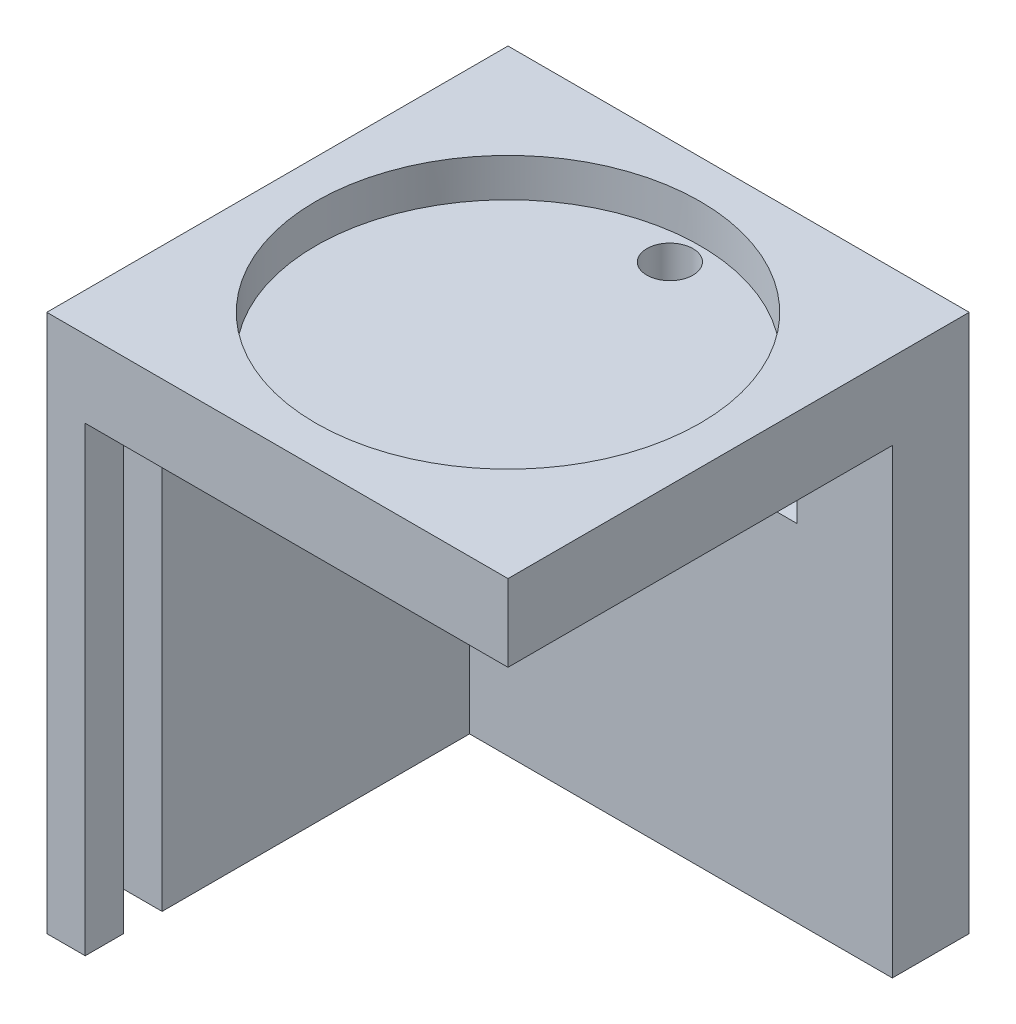
ISO-10303-21;
HEADER;
FILE_DESCRIPTION(('STEP AP214'),'2;1');
FILE_NAME('part.step','',(''),(''),'','','');
FILE_SCHEMA(('AUTOMOTIVE_DESIGN { 1 0 10303 214 1 1 1 1 }'));
ENDSEC;
DATA;
#1=APPLICATION_CONTEXT('core data for automotive mechanical design processes');
#2=APPLICATION_PROTOCOL_DEFINITION('international standard','automotive_design',2000,#1);
#3=PRODUCT_CONTEXT('',#1,'mechanical');
#4=PRODUCT('Part','Part','',(#3));
#5=PRODUCT_RELATED_PRODUCT_CATEGORY('part','',(#4));
#6=PRODUCT_DEFINITION_FORMATION('','',#4);
#7=PRODUCT_DEFINITION_CONTEXT('part definition',#1,'design');
#8=PRODUCT_DEFINITION('design','',#6,#7);
#9=PRODUCT_DEFINITION_SHAPE('','',#8);
#10=(LENGTH_UNIT() NAMED_UNIT(*) SI_UNIT(.MILLI.,.METRE.));
#11=(NAMED_UNIT(*) PLANE_ANGLE_UNIT() SI_UNIT($,.RADIAN.));
#12=(NAMED_UNIT(*) SI_UNIT($,.STERADIAN.) SOLID_ANGLE_UNIT());
#13=UNCERTAINTY_MEASURE_WITH_UNIT(LENGTH_MEASURE(1.E-05),#10,'distance_accuracy_value','');
#14=(GEOMETRIC_REPRESENTATION_CONTEXT(3) GLOBAL_UNCERTAINTY_ASSIGNED_CONTEXT((#13)) GLOBAL_UNIT_ASSIGNED_CONTEXT((#10,
#11,#12)) REPRESENTATION_CONTEXT('',''));
#15=CARTESIAN_POINT('',(0.,0.,0.));
#16=DIRECTION('',(0.,0.,1.));
#17=DIRECTION('',(1.,0.,0.));
#18=AXIS2_PLACEMENT_3D('',#15,#16,#17);
#19=CARTESIAN_POINT('',(0.,530.,0.));
#20=DIRECTION('',(0.,0.,-1.));
#21=DIRECTION('',(-1.,0.,0.));
#22=AXIS2_PLACEMENT_3D('',#19,#20,#21);
#23=PLANE('',#22);
#24=DIRECTION('',(0.,-1.,0.));
#25=VECTOR('',#24,1.);
#26=CARTESIAN_POINT('',(0.,530.,0.));
#27=LINE('',#26,#25);
#28=CARTESIAN_POINT('',(0.,280.,0.));
#29=VERTEX_POINT('',#28);
#30=CARTESIAN_POINT('',(0.,140.,0.));
#31=VERTEX_POINT('',#30);
#32=EDGE_CURVE('E174',#29,#31,#27,.T.);
#33=ORIENTED_EDGE('',*,*,#32,.T.);
#34=DIRECTION('',(-1.,0.,0.));
#35=VECTOR('',#34,1.);
#36=CARTESIAN_POINT('',(0.,140.,0.));
#37=LINE('',#36,#35);
#38=CARTESIAN_POINT('',(9.99999999999982,140.,0.));
#39=VERTEX_POINT('',#38);
#40=EDGE_CURVE('E159',#39,#31,#37,.T.);
#41=ORIENTED_EDGE('',*,*,#40,.F.);
#42=DIRECTION('',(0.,-1.,0.));
#43=VECTOR('',#42,1.);
#44=CARTESIAN_POINT('',(9.99999999999982,10.,0.));
#45=LINE('',#44,#43);
#46=CARTESIAN_POINT('',(9.99999999999982,260.,0.));
#47=VERTEX_POINT('',#46);
#48=EDGE_CURVE('E361',#47,#39,#45,.T.);
#49=ORIENTED_EDGE('',*,*,#48,.F.);
#50=DIRECTION('',(-1.,0.,0.));
#51=VECTOR('',#50,1.);
#52=CARTESIAN_POINT('',(9.99999999999982,260.,0.));
#53=LINE('',#52,#51);
#54=CARTESIAN_POINT('',(120.,260.,0.));
#55=VERTEX_POINT('',#54);
#56=EDGE_CURVE('E364',#55,#47,#53,.T.);
#57=ORIENTED_EDGE('',*,*,#56,.F.);
#58=DIRECTION('',(0.,1.,0.));
#59=VECTOR('',#58,1.);
#60=CARTESIAN_POINT('',(120.,0.,0.));
#61=LINE('',#60,#59);
#62=CARTESIAN_POINT('',(120.,280.,0.));
#63=VERTEX_POINT('',#62);
#64=EDGE_CURVE('E380',#55,#63,#61,.T.);
#65=ORIENTED_EDGE('',*,*,#64,.T.);
#66=DIRECTION('',(-1.,0.,0.));
#67=VECTOR('',#66,1.);
#68=CARTESIAN_POINT('',(0.,280.,0.));
#69=LINE('',#68,#67);
#70=EDGE_CURVE('E183',#63,#29,#69,.T.);
#71=ORIENTED_EDGE('',*,*,#70,.T.);
#72=EDGE_LOOP('',(#33,#41,#49,#57,#65,#71));
#73=FACE_BOUND('',#72,.T.);
#74=ADVANCED_FACE('F38',(#73),#23,.F.);
#75=CARTESIAN_POINT('',(0.,530.,-120.));
#76=DIRECTION('',(0.,0.,1.));
#77=DIRECTION('',(1.,0.,0.));
#78=AXIS2_PLACEMENT_3D('',#75,#76,#77);
#79=PLANE('',#78);
#80=DIRECTION('',(-1.,0.,0.));
#81=VECTOR('',#80,1.);
#82=CARTESIAN_POINT('',(0.,260.,-120.));
#83=LINE('',#82,#81);
#84=CARTESIAN_POINT('',(95.1986130371072,260.,-120.));
#85=VERTEX_POINT('',#84);
#86=CARTESIAN_POINT('',(75.1986130371072,260.,-120.));
#87=VERTEX_POINT('',#86);
#88=EDGE_CURVE('E435',#85,#87,#83,.T.);
#89=ORIENTED_EDGE('',*,*,#88,.T.);
#90=DIRECTION('',(0.,-1.,0.));
#91=VECTOR('',#90,1.);
#92=CARTESIAN_POINT('',(75.1986130371066,530.,-120.));
#93=LINE('',#92,#91);
#94=CARTESIAN_POINT('',(75.1986130371073,230.,-120.));
#95=VERTEX_POINT('',#94);
#96=EDGE_CURVE('E439',#87,#95,#93,.T.);
#97=ORIENTED_EDGE('',*,*,#96,.T.);
#98=DIRECTION('',(1.,0.,0.));
#99=VECTOR('',#98,1.);
#100=CARTESIAN_POINT('',(0.,230.,-120.));
#101=LINE('',#100,#99);
#102=CARTESIAN_POINT('',(95.1986130371072,230.,-120.));
#103=VERTEX_POINT('',#102);
#104=EDGE_CURVE('E418',#95,#103,#101,.T.);
#105=ORIENTED_EDGE('',*,*,#104,.T.);
#106=DIRECTION('',(0.,1.,0.));
#107=VECTOR('',#106,1.);
#108=CARTESIAN_POINT('',(95.1986130371072,530.,-120.));
#109=LINE('',#108,#107);
#110=EDGE_CURVE('E431',#103,#85,#109,.T.);
#111=ORIENTED_EDGE('',*,*,#110,.T.);
#112=EDGE_LOOP('',(#89,#97,#105,#111));
#113=FACE_BOUND('',#112,.T.);
#114=DIRECTION('',(0.,1.,0.));
#115=VECTOR('',#114,1.);
#116=CARTESIAN_POINT('',(120.,0.,-120.));
#117=LINE('',#116,#115);
#118=CARTESIAN_POINT('',(120.,140.,-120.));
#119=VERTEX_POINT('',#118);
#120=CARTESIAN_POINT('',(120.,280.,-120.));
#121=VERTEX_POINT('',#120);
#122=EDGE_CURVE('E583',#119,#121,#117,.T.);
#123=ORIENTED_EDGE('',*,*,#122,.F.);
#124=DIRECTION('',(-1.,0.,0.));
#125=VECTOR('',#124,1.);
#126=CARTESIAN_POINT('',(0.,140.,-120.));
#127=LINE('',#126,#125);
#128=CARTESIAN_POINT('',(0.,140.,-120.));
#129=VERTEX_POINT('',#128);
#130=EDGE_CURVE('E62',#119,#129,#127,.T.);
#131=ORIENTED_EDGE('',*,*,#130,.T.);
#132=DIRECTION('',(0.,-1.,0.));
#133=VECTOR('',#132,1.);
#134=CARTESIAN_POINT('',(0.,530.,-120.));
#135=LINE('',#134,#133);
#136=CARTESIAN_POINT('',(0.,280.,-120.));
#137=VERTEX_POINT('',#136);
#138=EDGE_CURVE('E187',#137,#129,#135,.T.);
#139=ORIENTED_EDGE('',*,*,#138,.F.);
#140=DIRECTION('',(1.,0.,0.));
#141=VECTOR('',#140,1.);
#142=CARTESIAN_POINT('',(0.,280.,-120.));
#143=LINE('',#142,#141);
#144=EDGE_CURVE('E388',#137,#121,#143,.T.);
#145=ORIENTED_EDGE('',*,*,#144,.T.);
#146=EDGE_LOOP('',(#123,#131,#139,#145));
#147=FACE_BOUND('',#146,.T.);
#148=ADVANCED_FACE('F217',(#113,#147),#79,.F.);
#149=CARTESIAN_POINT('',(9.99999999999982,260.,-100.));
#150=DIRECTION('',(0.,1.,0.));
#151=DIRECTION('',(0.,0.,1.));
#152=AXIS2_PLACEMENT_3D('',#149,#150,#151);
#153=PLANE('',#152);
#154=DIRECTION('',(0.,0.,-1.));
#155=VECTOR('',#154,1.);
#156=CARTESIAN_POINT('',(120.,260.,-100.));
#157=LINE('',#156,#155);
#158=CARTESIAN_POINT('',(120.,260.,-100.));
#159=VERTEX_POINT('',#158);
#160=EDGE_CURVE('E383',#55,#159,#157,.T.);
#161=ORIENTED_EDGE('',*,*,#160,.F.);
#162=ORIENTED_EDGE('',*,*,#56,.T.);
#163=DIRECTION('',(0.,0.,1.));
#164=VECTOR('',#163,1.);
#165=CARTESIAN_POINT('',(9.99999999999982,260.,-100.));
#166=LINE('',#165,#164);
#167=CARTESIAN_POINT('',(9.99999999999983,260.,-10.));
#168=VERTEX_POINT('',#167);
#169=EDGE_CURVE('E356',#168,#47,#166,.T.);
#170=ORIENTED_EDGE('',*,*,#169,.F.);
#171=DIRECTION('',(1.,0.,0.));
#172=VECTOR('',#171,1.);
#173=CARTESIAN_POINT('',(-47.0000000000002,260.,-10.));
#174=LINE('',#173,#172);
#175=CARTESIAN_POINT('',(0.,260.,-10.));
#176=VERTEX_POINT('',#175);
#177=EDGE_CURVE('E444',#176,#168,#174,.T.);
#178=ORIENTED_EDGE('',*,*,#177,.F.);
#179=DIRECTION('',(0.,0.,1.));
#180=VECTOR('',#179,1.);
#181=CARTESIAN_POINT('',(0.,260.,0.));
#182=LINE('',#181,#180);
#183=CARTESIAN_POINT('',(0.,260.,-20.));
#184=VERTEX_POINT('',#183);
#185=EDGE_CURVE('E460',#184,#176,#182,.T.);
#186=ORIENTED_EDGE('',*,*,#185,.F.);
#187=DIRECTION('',(1.,0.,0.));
#188=VECTOR('',#187,1.);
#189=CARTESIAN_POINT('',(-47.0000000000002,260.,-20.));
#190=LINE('',#189,#188);
#191=CARTESIAN_POINT('',(9.99999999999983,260.,-20.));
#192=VERTEX_POINT('',#191);
#193=EDGE_CURVE('E443',#184,#192,#190,.T.);
#194=ORIENTED_EDGE('',*,*,#193,.T.);
#195=CARTESIAN_POINT('',(9.99999999999982,260.,-100.));
#196=VERTEX_POINT('',#195);
#197=EDGE_CURVE('E193',#196,#192,#166,.T.);
#198=ORIENTED_EDGE('',*,*,#197,.F.);
#199=DIRECTION('',(-1.,0.,0.));
#200=VECTOR('',#199,1.);
#201=CARTESIAN_POINT('',(9.99999999999982,260.,-100.));
#202=LINE('',#201,#200);
#203=CARTESIAN_POINT('',(54.210671787897,260.,-100.));
#204=VERTEX_POINT('',#203);
#205=EDGE_CURVE('E352',#204,#196,#202,.T.);
#206=ORIENTED_EDGE('',*,*,#205,.F.);
#207=CARTESIAN_POINT('',(59.7046424125021,260.,-102.411697903133));
#208=DIRECTION('',(0.,1.,0.));
#209=DIRECTION('',(0.,0.,1.));
#210=AXIS2_PLACEMENT_3D('',#207,#208,#209);
#211=CIRCLE('',#210,5.99999999999999);
#212=CARTESIAN_POINT('',(65.1986130371072,260.,-100.));
#213=VERTEX_POINT('',#212);
#214=EDGE_CURVE('E340',#204,#213,#211,.T.);
#215=ORIENTED_EDGE('',*,*,#214,.T.);
#216=CARTESIAN_POINT('',(75.1986130371072,260.,-100.));
#217=VERTEX_POINT('',#216);
#218=EDGE_CURVE('E345',#217,#213,#202,.T.);
#219=ORIENTED_EDGE('',*,*,#218,.F.);
#220=DIRECTION('',(0.,0.,1.));
#221=VECTOR('',#220,1.);
#222=CARTESIAN_POINT('',(75.1986130371072,260.,-180.));
#223=LINE('',#222,#221);
#224=EDGE_CURVE('E415',#87,#217,#223,.T.);
#225=ORIENTED_EDGE('',*,*,#224,.F.);
#226=ORIENTED_EDGE('',*,*,#88,.F.);
#227=DIRECTION('',(0.,0.,1.));
#228=VECTOR('',#227,1.);
#229=CARTESIAN_POINT('',(95.1986130371072,260.,-180.));
#230=LINE('',#229,#228);
#231=CARTESIAN_POINT('',(95.1986130371072,260.,-100.));
#232=VERTEX_POINT('',#231);
#233=EDGE_CURVE('E419',#85,#232,#230,.T.);
#234=ORIENTED_EDGE('',*,*,#233,.T.);
#235=EDGE_CURVE('E351',#159,#232,#202,.T.);
#236=ORIENTED_EDGE('',*,*,#235,.F.);
#237=EDGE_LOOP('',(#161,#162,#170,#178,#186,#194,#198,#206,#215,#219,#225,#226,#234,#236));
#238=FACE_BOUND('',#237,.T.);
#239=ADVANCED_FACE('F212',(#238),#153,.F.);
#240=CARTESIAN_POINT('',(0.,0.,-100.));
#241=DIRECTION('',(0.,0.,-1.));
#242=DIRECTION('',(-1.,0.,0.));
#243=AXIS2_PLACEMENT_3D('',#240,#241,#242);
#244=PLANE('',#243);
#245=DIRECTION('',(0.,-1.,0.));
#246=VECTOR('',#245,1.);
#247=CARTESIAN_POINT('',(9.99999999999982,10.,-100.));
#248=LINE('',#247,#246);
#249=CARTESIAN_POINT('',(9.99999999999982,140.,-100.));
#250=VERTEX_POINT('',#249);
#251=EDGE_CURVE('E357',#196,#250,#248,.T.);
#252=ORIENTED_EDGE('',*,*,#251,.T.);
#253=DIRECTION('',(1.,0.,0.));
#254=VECTOR('',#253,1.);
#255=CARTESIAN_POINT('',(0.,140.,-100.));
#256=LINE('',#255,#254);
#257=CARTESIAN_POINT('',(120.,140.,-100.));
#258=VERTEX_POINT('',#257);
#259=EDGE_CURVE('E597',#250,#258,#256,.T.);
#260=ORIENTED_EDGE('',*,*,#259,.T.);
#261=DIRECTION('',(0.,-1.,0.));
#262=VECTOR('',#261,1.);
#263=CARTESIAN_POINT('',(120.,0.,-100.));
#264=LINE('',#263,#262);
#265=EDGE_CURVE('E389',#159,#258,#264,.T.);
#266=ORIENTED_EDGE('',*,*,#265,.F.);
#267=ORIENTED_EDGE('',*,*,#235,.T.);
#268=DIRECTION('',(0.,1.,0.));
#269=VECTOR('',#268,1.);
#270=CARTESIAN_POINT('',(95.1986130371072,260.,-100.));
#271=LINE('',#270,#269);
#272=CARTESIAN_POINT('',(95.1986130371072,230.,-100.));
#273=VERTEX_POINT('',#272);
#274=EDGE_CURVE('E410',#273,#232,#271,.T.);
#275=ORIENTED_EDGE('',*,*,#274,.F.);
#276=DIRECTION('',(1.,0.,0.));
#277=VECTOR('',#276,1.);
#278=CARTESIAN_POINT('',(75.1986130371073,230.,-100.));
#279=LINE('',#278,#277);
#280=CARTESIAN_POINT('',(75.1986130371073,230.,-100.));
#281=VERTEX_POINT('',#280);
#282=EDGE_CURVE('E406',#281,#273,#279,.T.);
#283=ORIENTED_EDGE('',*,*,#282,.F.);
#284=DIRECTION('',(0.,-1.,0.));
#285=VECTOR('',#284,1.);
#286=CARTESIAN_POINT('',(75.1986130371072,260.,-100.));
#287=LINE('',#286,#285);
#288=EDGE_CURVE('E348',#217,#281,#287,.T.);
#289=ORIENTED_EDGE('',*,*,#288,.F.);
#290=ORIENTED_EDGE('',*,*,#218,.T.);
#291=DIRECTION('',(0.,1.,0.));
#292=VECTOR('',#291,1.);
#293=CARTESIAN_POINT('',(65.1986130371072,270.,-100.));
#294=LINE('',#293,#292);
#295=CARTESIAN_POINT('',(65.1986130371072,240.,-100.));
#296=VERTEX_POINT('',#295);
#297=EDGE_CURVE('E47',#213,#296,#294,.F.);
#298=ORIENTED_EDGE('',*,*,#297,.T.);
#299=CARTESIAN_POINT('',(28.884804483325,254.969873540039,-100.));
#300=CARTESIAN_POINT('',(29.9672365347338,254.321481530732,-100.));
#301=CARTESIAN_POINT('',(31.0497464545614,253.673219387853,-100.));
#302=CARTESIAN_POINT('',(33.2150595787217,252.377107204606,-100.));
#303=CARTESIAN_POINT('',(34.297862791265,251.729257177956,-100.));
#304=CARTESIAN_POINT('',(36.4647060923729,250.433639744473,-100.));
#305=CARTESIAN_POINT('',(37.5487464735914,249.785872826956,-100.));
#306=CARTESIAN_POINT('',(39.7173518702003,248.491293807832,-100.));
#307=CARTESIAN_POINT('',(40.8019168683608,247.844481677366,-100.));
#308=CARTESIAN_POINT('',(42.9553729331005,246.562231273058,-100.));
#309=CARTESIAN_POINT('',(44.0242503914648,245.926770167334,-100.));
#310=CARTESIAN_POINT('',(45.6287999579788,244.975543070018,-100.));
#311=CARTESIAN_POINT('',(46.1638807358486,244.658779849155,-100.));
#312=CARTESIAN_POINT('',(47.2345996849411,244.02620691197,-100.));
#313=CARTESIAN_POINT('',(47.7702378512602,243.710397187355,-100.));
#314=CARTESIAN_POINT('',(48.8420562926985,243.080332616974,-100.));
#315=CARTESIAN_POINT('',(49.3782361454499,242.766077052952,-100.));
#316=CARTESIAN_POINT('',(50.4518617898759,242.139688895126,-100.));
#317=CARTESIAN_POINT('',(50.9893076237302,241.827556373442,-100.));
#318=CARTESIAN_POINT('',(51.7969920231621,241.362087348948,-100.));
#319=CARTESIAN_POINT('',(52.0664507902224,241.207398435582,-100.));
#320=CARTESIAN_POINT('',(52.6060676189059,240.899245932647,-100.));
#321=CARTESIAN_POINT('',(52.8762256778316,240.745782338362,-100.));
#322=CARTESIAN_POINT('',(53.4174793016406,240.440550986433,-100.));
#323=CARTESIAN_POINT('',(53.6885748139096,240.288783135576,-100.));
#324=CARTESIAN_POINT('',(54.2320981181953,239.987654952325,-100.));
#325=CARTESIAN_POINT('',(54.5045258826987,239.838294570485,-100.));
#326=CARTESIAN_POINT('',(54.8905096253088,239.629997826919,-100.));
#327=CARTESIAN_POINT('',(55.0032518803767,239.569553741312,-100.));
#328=CARTESIAN_POINT('',(55.2291351822772,239.449412152825,-100.));
#329=CARTESIAN_POINT('',(55.3422762325353,239.389714656378,-100.));
#330=CARTESIAN_POINT('',(55.5690508499117,239.271212746692,-100.));
#331=CARTESIAN_POINT('',(55.6826844997584,239.212408491575,-100.));
#332=CARTESIAN_POINT('',(55.9105190626271,239.095908772699,-100.));
#333=CARTESIAN_POINT('',(56.0247199732301,239.038213304217,-100.));
#334=CARTESIAN_POINT('',(56.254727623449,238.923739431424,-100.));
#335=CARTESIAN_POINT('',(56.3705398937001,238.866972114577,-100.));
#336=CARTESIAN_POINT('',(56.6030100449886,238.755197606459,-100.));
#337=CARTESIAN_POINT('',(56.7196679079331,238.700190377664,-100.));
#338=CARTESIAN_POINT('',(56.9539979611086,238.592429326373,-100.));
#339=CARTESIAN_POINT('',(57.0716699575345,238.539675084315,-100.));
#340=CARTESIAN_POINT('',(57.3082691577744,238.437071995837,-100.));
#341=CARTESIAN_POINT('',(57.4271962695247,238.387222938045,-100.));
#342=CARTESIAN_POINT('',(57.6869781317306,238.283138615429,-100.));
#343=CARTESIAN_POINT('',(57.8281165232553,238.229603123554,-100.));
#344=CARTESIAN_POINT('',(58.1129656960515,238.129686071773,-100.));
#345=CARTESIAN_POINT('',(58.2566767876243,238.083305381406,-100.));
#346=CARTESIAN_POINT('',(58.5450092107517,238.000964128693,-100.));
#347=CARTESIAN_POINT('',(58.689591899164,237.964871034862,-100.));
#348=CARTESIAN_POINT('',(58.9814127951544,237.905451187338,-100.));
#349=CARTESIAN_POINT('',(59.1286497853335,237.882118727476,-100.));
#350=CARTESIAN_POINT('',(59.3522776552634,237.858628430009,-100.));
#351=CARTESIAN_POINT('',(59.4280841248127,237.852717384579,-100.));
#352=CARTESIAN_POINT('',(59.5799152050125,237.845156408174,-100.));
#353=CARTESIAN_POINT('',(59.6559398126441,237.843506418514,-100.));
#354=CARTESIAN_POINT('',(59.8079498687516,237.844540454906,-100.));
#355=CARTESIAN_POINT('',(59.8839353209988,237.847223925198,-100.));
#356=CARTESIAN_POINT('',(60.035631864763,237.856810655764,-100.));
#357=CARTESIAN_POINT('',(60.1113429502036,237.863714008925,-100.));
#358=CARTESIAN_POINT('',(60.3396435550122,237.890619953938,-100.));
#359=CARTESIAN_POINT('',(60.4915359650625,237.91679705225,-100.));
#360=CARTESIAN_POINT('',(60.7171425525939,237.965886603227,-100.));
#361=CARTESIAN_POINT('',(60.7920043637025,237.983896936361,-100.));
#362=CARTESIAN_POINT('',(60.9409921750784,238.022753494069,-100.));
#363=CARTESIAN_POINT('',(61.0151181998639,238.043599623805,-100.));
#364=CARTESIAN_POINT('',(61.1968441480016,238.097952124578,-100.));
#365=CARTESIAN_POINT('',(61.3040266585421,238.132846601481,-100.));
#366=CARTESIAN_POINT('',(61.516977956672,238.206736697414,-100.));
#367=CARTESIAN_POINT('',(61.6227464316528,238.245733206943,-100.));
#368=CARTESIAN_POINT('',(61.8331161284513,238.326973209184,-100.));
#369=CARTESIAN_POINT('',(61.937716375691,238.36921921027,-100.));
#370=CARTESIAN_POINT('',(62.1458560820775,238.456256255892,-100.));
#371=CARTESIAN_POINT('',(62.2493954567668,238.50104750123,-100.));
#372=CARTESIAN_POINT('',(62.5591935422233,238.638650022707,-100.));
#373=CARTESIAN_POINT('',(62.7641081929736,238.734481297377,-100.));
#374=CARTESIAN_POINT('',(63.1713170213154,238.931265173498,-100.));
#375=CARTESIAN_POINT('',(63.3736123206679,239.032215485033,-100.));
#376=CARTESIAN_POINT('',(63.7785399430973,239.238713763357,-100.));
#377=CARTESIAN_POINT('',(63.9811531526758,239.344299095153,-100.));
#378=CARTESIAN_POINT('',(64.3850688546911,239.557985899018,-100.));
#379=CARTESIAN_POINT('',(64.5863712139654,239.666087621764,-100.));
#380=CARTESIAN_POINT('',(64.9876108578471,239.883900249455,-100.));
#381=CARTESIAN_POINT('',(65.187549999534,239.993607739687,-100.));
#382=CARTESIAN_POINT('',(65.5866728839526,240.21436907586,-100.));
#383=CARTESIAN_POINT('',(65.7858566538868,240.325422872701,-100.));
#384=CARTESIAN_POINT('',(66.3872595832787,240.662750482346,-100.));
#385=CARTESIAN_POINT('',(66.7885952582659,240.890598267732,-100.));
#386=CARTESIAN_POINT('',(67.589814847009,241.348834661592,-100.));
#387=CARTESIAN_POINT('',(67.9896987425985,241.579223301714,-100.));
#388=CARTESIAN_POINT('',(68.7885080542074,242.041694812519,-100.));
#389=CARTESIAN_POINT('',(69.1874334281666,242.273777755807,-100.));
#390=CARTESIAN_POINT('',(69.9846027987916,242.739111431985,-100.));
#391=CARTESIAN_POINT('',(70.3828467941878,242.972362167048,-100.));
#392=CARTESIAN_POINT('',(71.5775889201872,243.673786797531,-100.));
#393=CARTESIAN_POINT('',(72.3733574511927,244.14320294416,-100.));
#394=CARTESIAN_POINT('',(73.9637810731419,245.083873173762,-100.));
#395=CARTESIAN_POINT('',(74.7584361892068,245.555127214329,-100.));
#396=CARTESIAN_POINT('',(76.2985564308671,246.469993303916,-100.));
#397=CARTESIAN_POINT('',(77.0440625728734,246.913536314761,-100.));
#398=CARTESIAN_POINT('',(78.5346649003785,247.801323122441,-100.));
#399=CARTESIAN_POINT('',(79.279761082761,248.245566924508,-100.));
#400=CARTESIAN_POINT('',(80.7689094560383,249.134100328378,-100.));
#401=CARTESIAN_POINT('',(81.5129619429465,249.57838943415,-100.));
#402=CARTESIAN_POINT('',(83.0008398580189,250.467334145593,-100.));
#403=CARTESIAN_POINT('',(83.7446652879578,250.911989748292,-100.));
#404=CARTESIAN_POINT('',(84.4884164773338,251.356769348352,-100.));
#405=B_SPLINE_CURVE_WITH_KNOTS('',3,(#299,#300,#301,#302,#303,#304,#305,#306,#307,#308,#309,
#310,#311,#312,#313,#314,#315,#316,#317,#318,#319,#320,#321,#322,#323,#324,#325,#326,#327,#328,
#329,#330,#331,#332,#333,#334,#335,#336,#337,#338,#339,#340,#341,#342,#343,#344,#345,#346,#347,
#348,#349,#350,#351,#352,#353,#354,#355,#356,#357,#358,#359,#360,#361,#362,#363,#364,#365,#366,
#367,#368,#369,#370,#371,#372,#373,#374,#375,#376,#377,#378,#379,#380,#381,#382,#383,#384,#385,
#386,#387,#388,#389,#390,#391,#392,#393,#394,#395,#396,#397,#398,#399,#400,#401,#402,#403,#404),
.UNSPECIFIED.,.F.,.F.,(4,2,2,2,2,2,2,2,2,2,2,2,2,2,2,2,2,2,2,2,2,2,2,2,2,2,2,2,2,2,2,2,2,2,2,2,
2,2,2,2,2,2,2,2,2,2,2,2,2,2,2,2,4),(0.,3.78531937023237,7.57075875484564,11.3592554354743,
15.1476351564797,18.878153732474,20.7435896432933,22.6090092796195,24.473466320833,
26.3379863860952,27.2700948315591,28.2021996866972,29.1342530504266,30.0662872463865,
30.4500541971887,30.8338244525877,31.2176618701857,31.6014976523624,31.9884162982846,
32.3753266897244,32.7621647118865,33.1489745536988,33.6016893460421,34.0544591145965,
34.5011010485225,34.9475430940559,35.1755487084095,35.4035511825768,35.631524418115,
35.859502671975,36.3210233505236,36.5519818353813,36.7829325981315,37.1209808144366,
37.459102568607,37.7974879996292,38.1359001638962,38.814415384013,39.4926297142804,
40.1780255690424,40.8634899961031,41.5476632422642,42.2318116112759,43.6163021264572,
45.000809906768,46.3853773690292,47.7699474085378,50.5416546361106,53.3132982866479,
55.9157173670281,58.5181559640704,61.1179754922295,63.7177741493244),.UNSPECIFIED.);
#406=CARTESIAN_POINT('',(54.210671787897,240.,-100.));
#407=VERTEX_POINT('',#406);
#408=EDGE_CURVE('E186',#296,#407,#405,.F.);
#409=ORIENTED_EDGE('',*,*,#408,.T.);
#410=DIRECTION('',(0.,1.,0.));
#411=VECTOR('',#410,1.);
#412=CARTESIAN_POINT('',(54.210671787897,270.,-100.));
#413=LINE('',#412,#411);
#414=EDGE_CURVE('E11',#407,#204,#413,.T.);
#415=ORIENTED_EDGE('',*,*,#414,.T.);
#416=ORIENTED_EDGE('',*,*,#205,.T.);
#417=EDGE_LOOP('',(#252,#260,#266,#267,#275,#283,#289,#290,#298,#409,#415,#416));
#418=FACE_BOUND('',#417,.T.);
#419=ADVANCED_FACE('F206',(#418),#244,.F.);
#420=CARTESIAN_POINT('',(340.,280.,-100.));
#421=DIRECTION('',(0.,-1.,0.));
#422=DIRECTION('',(0.,0.,-1.));
#423=AXIS2_PLACEMENT_3D('',#420,#421,#422);
#424=PLANE('',#423);
#425=CARTESIAN_POINT('',(60.,280.,-60.));
#426=DIRECTION('',(0.,-1.,0.));
#427=DIRECTION('',(0.,0.,-1.));
#428=AXIS2_PLACEMENT_3D('',#425,#426,#427);
#429=CIRCLE('',#428,50.);
#430=CARTESIAN_POINT('',(60.,280.,-110.));
#431=VERTEX_POINT('',#430);
#432=EDGE_CURVE('E365',#431,#431,#429,.T.);
#433=ORIENTED_EDGE('',*,*,#432,.T.);
#434=EDGE_LOOP('',(#433));
#435=FACE_BOUND('',#434,.T.);
#436=DIRECTION('',(0.,0.,1.));
#437=VECTOR('',#436,1.);
#438=CARTESIAN_POINT('',(120.,280.,-120.));
#439=LINE('',#438,#437);
#440=EDGE_CURVE('E396',#121,#63,#439,.T.);
#441=ORIENTED_EDGE('',*,*,#440,.F.);
#442=ORIENTED_EDGE('',*,*,#144,.F.);
#443=DIRECTION('',(0.,0.,1.));
#444=VECTOR('',#443,1.);
#445=CARTESIAN_POINT('',(0.,280.,-120.));
#446=LINE('',#445,#444);
#447=EDGE_CURVE('E394',#137,#29,#446,.T.);
#448=ORIENTED_EDGE('',*,*,#447,.T.);
#449=ORIENTED_EDGE('',*,*,#70,.F.);
#450=EDGE_LOOP('',(#441,#442,#448,#449));
#451=FACE_BOUND('',#450,.T.);
#452=ADVANCED_FACE('F211',(#435,#451),#424,.F.);
#453=CARTESIAN_POINT('',(9.99999999999982,10.,-100.));
#454=DIRECTION('',(-1.,0.,0.));
#455=DIRECTION('',(0.,0.,1.));
#456=AXIS2_PLACEMENT_3D('',#453,#454,#455);
#457=PLANE('',#456);
#458=ORIENTED_EDGE('',*,*,#48,.T.);
#459=DIRECTION('',(0.,0.,-1.));
#460=VECTOR('',#459,1.);
#461=CARTESIAN_POINT('',(9.99999999999982,140.,-100.));
#462=LINE('',#461,#460);
#463=CARTESIAN_POINT('',(9.99999999999983,140.,-10.));
#464=VERTEX_POINT('',#463);
#465=EDGE_CURVE('E162',#39,#464,#462,.T.);
#466=ORIENTED_EDGE('',*,*,#465,.T.);
#467=DIRECTION('',(0.,1.,0.));
#468=VECTOR('',#467,1.);
#469=CARTESIAN_POINT('',(9.99999999999982,10.,-9.99999999999999));
#470=LINE('',#469,#468);
#471=EDGE_CURVE('E376',#464,#168,#470,.T.);
#472=ORIENTED_EDGE('',*,*,#471,.T.);
#473=ORIENTED_EDGE('',*,*,#169,.T.);
#474=EDGE_LOOP('',(#458,#466,#472,#473));
#475=FACE_BOUND('',#474,.T.);
#476=ADVANCED_FACE('F224',(#475),#457,.F.);
#477=CARTESIAN_POINT('',(0.,530.,0.));
#478=DIRECTION('',(1.,0.,0.));
#479=DIRECTION('',(0.,0.,-1.));
#480=AXIS2_PLACEMENT_3D('',#477,#478,#479);
#481=PLANE('',#480);
#482=ORIENTED_EDGE('',*,*,#138,.T.);
#483=DIRECTION('',(0.,0.,1.));
#484=VECTOR('',#483,1.);
#485=CARTESIAN_POINT('',(0.,140.,-120.));
#486=LINE('',#485,#484);
#487=CARTESIAN_POINT('',(0.,140.,-20.));
#488=VERTEX_POINT('',#487);
#489=EDGE_CURVE('E178',#129,#488,#486,.T.);
#490=ORIENTED_EDGE('',*,*,#489,.T.);
#491=DIRECTION('',(0.,1.,0.));
#492=VECTOR('',#491,1.);
#493=CARTESIAN_POINT('',(0.,530.,-20.));
#494=LINE('',#493,#492);
#495=EDGE_CURVE('E453',#488,#184,#494,.T.);
#496=ORIENTED_EDGE('',*,*,#495,.T.);
#497=ORIENTED_EDGE('',*,*,#185,.T.);
#498=DIRECTION('',(0.,-1.,0.));
#499=VECTOR('',#498,1.);
#500=CARTESIAN_POINT('',(0.,530.,-10.));
#501=LINE('',#500,#499);
#502=CARTESIAN_POINT('',(0.,140.,-10.));
#503=VERTEX_POINT('',#502);
#504=EDGE_CURVE('E176',#176,#503,#501,.T.);
#505=ORIENTED_EDGE('',*,*,#504,.T.);
#506=EDGE_CURVE('E54',#503,#31,#486,.T.);
#507=ORIENTED_EDGE('',*,*,#506,.T.);
#508=ORIENTED_EDGE('',*,*,#32,.F.);
#509=ORIENTED_EDGE('',*,*,#447,.F.);
#510=EDGE_LOOP('',(#482,#490,#496,#497,#505,#507,#508,#509));
#511=FACE_BOUND('',#510,.T.);
#512=ADVANCED_FACE('F40',(#511),#481,.F.);
#513=DIRECTION('',(0.,-1.,0.));
#514=VECTOR('',#513,1.);
#515=CARTESIAN_POINT('',(9.99999999999982,10.,-20.));
#516=LINE('',#515,#514);
#517=CARTESIAN_POINT('',(9.99999999999983,140.,-20.));
#518=VERTEX_POINT('',#517);
#519=EDGE_CURVE('E447',#192,#518,#516,.T.);
#520=ORIENTED_EDGE('',*,*,#519,.T.);
#521=DIRECTION('',(0.,0.,-1.));
#522=VECTOR('',#521,1.);
#523=CARTESIAN_POINT('',(9.99999999999982,140.,-100.));
#524=LINE('',#523,#522);
#525=EDGE_CURVE('E603',#518,#250,#524,.T.);
#526=ORIENTED_EDGE('',*,*,#525,.T.);
#527=ORIENTED_EDGE('',*,*,#251,.F.);
#528=ORIENTED_EDGE('',*,*,#197,.T.);
#529=EDGE_LOOP('',(#520,#526,#527,#528));
#530=FACE_BOUND('',#529,.T.);
#531=ADVANCED_FACE('F219',(#530),#457,.F.);
#532=CARTESIAN_POINT('',(60.,270.,-60.));
#533=DIRECTION('',(0.,1.,0.));
#534=DIRECTION('',(0.,0.,1.));
#535=AXIS2_PLACEMENT_3D('',#532,#533,#534);
#536=CYLINDRICAL_SURFACE('',#535,50.);
#537=CARTESIAN_POINT('',(60.,270.,-60.));
#538=DIRECTION('',(0.,1.,0.));
#539=DIRECTION('',(0.,0.,1.));
#540=AXIS2_PLACEMENT_3D('',#537,#538,#539);
#541=CIRCLE('',#540,50.);
#542=CARTESIAN_POINT('',(60.,270.,-9.99999999999999));
#543=VERTEX_POINT('',#542);
#544=EDGE_CURVE('E467',#543,#543,#541,.T.);
#545=ORIENTED_EDGE('',*,*,#544,.F.);
#546=EDGE_LOOP('',(#545));
#547=FACE_BOUND('',#546,.T.);
#548=ORIENTED_EDGE('',*,*,#432,.F.);
#549=EDGE_LOOP('',(#548));
#550=FACE_BOUND('',#549,.T.);
#551=ADVANCED_FACE('F222',(#547,#550),#536,.F.);
#552=CARTESIAN_POINT('',(60.,270.,-60.));
#553=DIRECTION('',(0.,1.,0.));
#554=DIRECTION('',(0.,0.,1.));
#555=AXIS2_PLACEMENT_3D('',#552,#553,#554);
#556=PLANE('',#555);
#557=CARTESIAN_POINT('',(59.7046424125021,270.,-102.411697903133));
#558=DIRECTION('',(0.,1.,0.));
#559=DIRECTION('',(0.,0.,1.));
#560=AXIS2_PLACEMENT_3D('',#557,#558,#559);
#561=CIRCLE('',#560,5.99999999999999);
#562=CARTESIAN_POINT('',(59.7046424125021,270.,-96.4116979031329));
#563=VERTEX_POINT('',#562);
#564=EDGE_CURVE('E331',#563,#563,#561,.T.);
#565=ORIENTED_EDGE('',*,*,#564,.F.);
#566=EDGE_LOOP('',(#565));
#567=FACE_BOUND('',#566,.T.);
#568=ORIENTED_EDGE('',*,*,#544,.T.);
#569=EDGE_LOOP('',(#568));
#570=FACE_BOUND('',#569,.T.);
#571=ADVANCED_FACE('F321',(#567,#570),#556,.T.);
#572=CARTESIAN_POINT('',(59.7046424125021,270.,-102.411697903133));
#573=DIRECTION('',(0.,1.,0.));
#574=DIRECTION('',(0.,0.,1.));
#575=AXIS2_PLACEMENT_3D('',#572,#573,#574);
#576=CYLINDRICAL_SURFACE('',#575,5.99999999999999);
#577=ORIENTED_EDGE('',*,*,#564,.T.);
#578=EDGE_LOOP('',(#577));
#579=FACE_BOUND('',#578,.T.);
#580=CARTESIAN_POINT('',(59.7046424125021,240.,-102.411697903133));
#581=DIRECTION('',(0.,1.,0.));
#582=DIRECTION('',(0.,0.,1.));
#583=AXIS2_PLACEMENT_3D('',#580,#581,#582);
#584=CIRCLE('',#583,5.99999999999999);
#585=EDGE_CURVE('E335',#296,#407,#584,.T.);
#586=ORIENTED_EDGE('',*,*,#585,.F.);
#587=ORIENTED_EDGE('',*,*,#297,.F.);
#588=ORIENTED_EDGE('',*,*,#214,.F.);
#589=ORIENTED_EDGE('',*,*,#414,.F.);
#590=EDGE_LOOP('',(#586,#587,#588,#589));
#591=FACE_BOUND('',#590,.T.);
#592=ADVANCED_FACE('F319',(#579,#591),#576,.F.);
#593=CARTESIAN_POINT('',(59.7046424125021,240.,-102.411697903133));
#594=DIRECTION('',(0.,1.,0.));
#595=DIRECTION('',(0.,0.,1.));
#596=AXIS2_PLACEMENT_3D('',#593,#594,#595);
#597=CONICAL_SURFACE('',#596,5.99999999999999,1.02974425867665);
#598=CARTESIAN_POINT('',(59.7046424125021,236.394836285835,-102.411697903133));
#599=VERTEX_POINT('',#598);
#600=VERTEX_LOOP('',#599);
#601=FACE_BOUND('',#600,.T.);
#602=ORIENTED_EDGE('',*,*,#585,.T.);
#603=ORIENTED_EDGE('',*,*,#408,.F.);
#604=EDGE_LOOP('',(#602,#603));
#605=FACE_BOUND('',#604,.T.);
#606=ADVANCED_FACE('F202',(#601,#605),#597,.F.);
#607=CARTESIAN_POINT('',(-47.0000000000002,10.,-10.));
#608=DIRECTION('',(0.,0.,1.));
#609=DIRECTION('',(1.,0.,0.));
#610=AXIS2_PLACEMENT_3D('',#607,#608,#609);
#611=PLANE('',#610);
#612=ORIENTED_EDGE('',*,*,#471,.F.);
#613=DIRECTION('',(-1.,0.,0.));
#614=VECTOR('',#613,1.);
#615=CARTESIAN_POINT('',(-47.0000000000002,140.,-10.));
#616=LINE('',#615,#614);
#617=EDGE_CURVE('E595',#464,#503,#616,.T.);
#618=ORIENTED_EDGE('',*,*,#617,.T.);
#619=ORIENTED_EDGE('',*,*,#504,.F.);
#620=ORIENTED_EDGE('',*,*,#177,.T.);
#621=EDGE_LOOP('',(#612,#618,#619,#620));
#622=FACE_BOUND('',#621,.T.);
#623=ADVANCED_FACE('F267',(#622),#611,.F.);
#624=CARTESIAN_POINT('',(-47.0000000000002,10.,-20.));
#625=DIRECTION('',(0.,0.,-1.));
#626=DIRECTION('',(-1.,0.,0.));
#627=AXIS2_PLACEMENT_3D('',#624,#625,#626);
#628=PLANE('',#627);
#629=ORIENTED_EDGE('',*,*,#495,.F.);
#630=DIRECTION('',(1.,0.,0.));
#631=VECTOR('',#630,1.);
#632=CARTESIAN_POINT('',(-47.0000000000002,140.,-20.));
#633=LINE('',#632,#631);
#634=EDGE_CURVE('E591',#488,#518,#633,.T.);
#635=ORIENTED_EDGE('',*,*,#634,.T.);
#636=ORIENTED_EDGE('',*,*,#519,.F.);
#637=ORIENTED_EDGE('',*,*,#193,.F.);
#638=EDGE_LOOP('',(#629,#635,#636,#637));
#639=FACE_BOUND('',#638,.T.);
#640=ADVANCED_FACE('F271',(#639),#628,.F.);
#641=CARTESIAN_POINT('',(75.1986130371072,260.,-180.));
#642=DIRECTION('',(-1.,0.,0.));
#643=DIRECTION('',(0.,-1.,0.));
#644=AXIS2_PLACEMENT_3D('',#641,#642,#643);
#645=PLANE('',#644);
#646=ORIENTED_EDGE('',*,*,#224,.T.);
#647=ORIENTED_EDGE('',*,*,#288,.T.);
#648=DIRECTION('',(0.,0.,1.));
#649=VECTOR('',#648,1.);
#650=CARTESIAN_POINT('',(75.1986130371073,230.,-180.));
#651=LINE('',#650,#649);
#652=EDGE_CURVE('E414',#95,#281,#651,.T.);
#653=ORIENTED_EDGE('',*,*,#652,.F.);
#654=ORIENTED_EDGE('',*,*,#96,.F.);
#655=EDGE_LOOP('',(#646,#647,#653,#654));
#656=FACE_BOUND('',#655,.T.);
#657=ADVANCED_FACE('F280',(#656),#645,.F.);
#658=CARTESIAN_POINT('',(95.1986130371072,260.,-180.));
#659=DIRECTION('',(1.,0.,0.));
#660=DIRECTION('',(0.,0.,-1.));
#661=AXIS2_PLACEMENT_3D('',#658,#659,#660);
#662=PLANE('',#661);
#663=DIRECTION('',(0.,0.,1.));
#664=VECTOR('',#663,1.);
#665=CARTESIAN_POINT('',(95.1986130371072,230.,-180.));
#666=LINE('',#665,#664);
#667=EDGE_CURVE('E422',#103,#273,#666,.T.);
#668=ORIENTED_EDGE('',*,*,#667,.T.);
#669=ORIENTED_EDGE('',*,*,#274,.T.);
#670=ORIENTED_EDGE('',*,*,#233,.F.);
#671=ORIENTED_EDGE('',*,*,#110,.F.);
#672=EDGE_LOOP('',(#668,#669,#670,#671));
#673=FACE_BOUND('',#672,.T.);
#674=ADVANCED_FACE('F311',(#673),#662,.F.);
#675=CARTESIAN_POINT('',(75.1986130371073,230.,-180.));
#676=DIRECTION('',(0.,-1.,0.));
#677=DIRECTION('',(0.,0.,-1.));
#678=AXIS2_PLACEMENT_3D('',#675,#676,#677);
#679=PLANE('',#678);
#680=ORIENTED_EDGE('',*,*,#652,.T.);
#681=ORIENTED_EDGE('',*,*,#282,.T.);
#682=ORIENTED_EDGE('',*,*,#667,.F.);
#683=ORIENTED_EDGE('',*,*,#104,.F.);
#684=EDGE_LOOP('',(#680,#681,#682,#683));
#685=FACE_BOUND('',#684,.T.);
#686=ADVANCED_FACE('F291',(#685),#679,.F.);
#687=CARTESIAN_POINT('',(120.,0.,-120.));
#688=DIRECTION('',(1.,0.,0.));
#689=DIRECTION('',(0.,0.,-1.));
#690=AXIS2_PLACEMENT_3D('',#687,#688,#689);
#691=PLANE('',#690);
#692=DIRECTION('',(0.,0.,1.));
#693=VECTOR('',#692,1.);
#694=CARTESIAN_POINT('',(120.,140.,-120.));
#695=LINE('',#694,#693);
#696=EDGE_CURVE('E179',#119,#258,#695,.T.);
#697=ORIENTED_EDGE('',*,*,#696,.F.);
#698=ORIENTED_EDGE('',*,*,#122,.T.);
#699=ORIENTED_EDGE('',*,*,#440,.T.);
#700=ORIENTED_EDGE('',*,*,#64,.F.);
#701=ORIENTED_EDGE('',*,*,#160,.T.);
#702=ORIENTED_EDGE('',*,*,#265,.T.);
#703=EDGE_LOOP('',(#697,#698,#699,#700,#701,#702));
#704=FACE_BOUND('',#703,.T.);
#705=ADVANCED_FACE('F286',(#704),#691,.T.);
#706=CARTESIAN_POINT('',(0.,140.,-120.));
#707=DIRECTION('',(0.,1.,0.));
#708=DIRECTION('',(0.,0.,1.));
#709=AXIS2_PLACEMENT_3D('',#706,#707,#708);
#710=PLANE('',#709);
#711=ORIENTED_EDGE('',*,*,#525,.F.);
#712=ORIENTED_EDGE('',*,*,#634,.F.);
#713=ORIENTED_EDGE('',*,*,#489,.F.);
#714=ORIENTED_EDGE('',*,*,#130,.F.);
#715=ORIENTED_EDGE('',*,*,#696,.T.);
#716=ORIENTED_EDGE('',*,*,#259,.F.);
#717=EDGE_LOOP('',(#711,#712,#713,#714,#715,#716));
#718=FACE_BOUND('',#717,.T.);
#719=ADVANCED_FACE('F290',(#718),#710,.F.);
#720=ORIENTED_EDGE('',*,*,#40,.T.);
#721=ORIENTED_EDGE('',*,*,#506,.F.);
#722=ORIENTED_EDGE('',*,*,#617,.F.);
#723=ORIENTED_EDGE('',*,*,#465,.F.);
#724=EDGE_LOOP('',(#720,#721,#722,#723));
#725=FACE_BOUND('',#724,.T.);
#726=ADVANCED_FACE('F160',(#725),#710,.F.);
#727=CLOSED_SHELL('',(#74,#148,#239,#419,#452,#476,#512,#531,#551,#571,#592,#606,#623,#640,#657,
#674,#686,#705,#719,#726));
#728=MANIFOLD_SOLID_BREP('B2',#727);
#729=ADVANCED_BREP_SHAPE_REPRESENTATION('',(#18,#728),#14);
#730=SHAPE_DEFINITION_REPRESENTATION(#9,#729);
ENDSEC;
END-ISO-10303-21;
